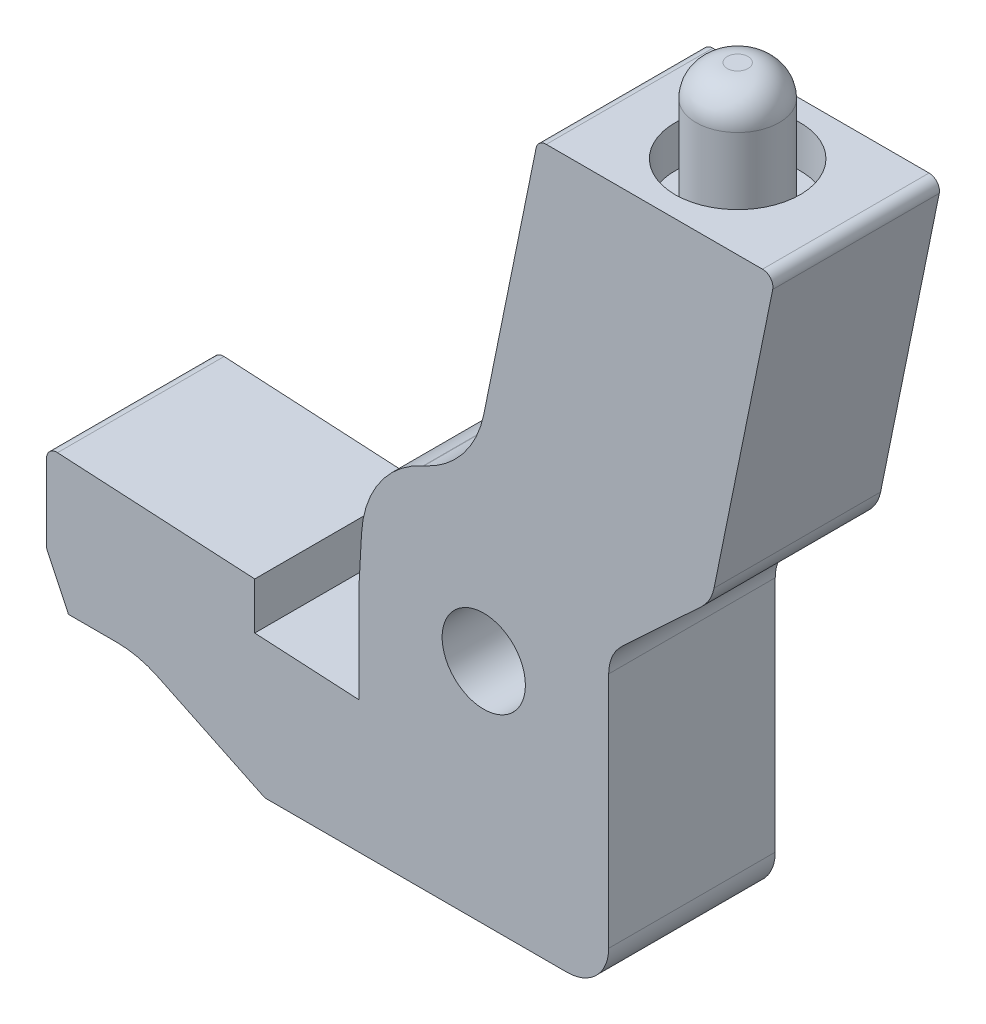
ISO-10303-21;
HEADER;
FILE_DESCRIPTION(('STEP AP214'),'2;1');
FILE_NAME('part.step','',(''),(''),'','','');
FILE_SCHEMA(('AUTOMOTIVE_DESIGN { 1 0 10303 214 1 1 1 1 }'));
ENDSEC;
DATA;
#1=APPLICATION_CONTEXT('core data for automotive mechanical design processes');
#2=APPLICATION_PROTOCOL_DEFINITION('international standard','automotive_design',2000,#1);
#3=PRODUCT_CONTEXT('',#1,'mechanical');
#4=PRODUCT('Part','Part','',(#3));
#5=PRODUCT_RELATED_PRODUCT_CATEGORY('part','',(#4));
#6=PRODUCT_DEFINITION_FORMATION('','',#4);
#7=PRODUCT_DEFINITION_CONTEXT('part definition',#1,'design');
#8=PRODUCT_DEFINITION('design','',#6,#7);
#9=PRODUCT_DEFINITION_SHAPE('','',#8);
#10=(LENGTH_UNIT() NAMED_UNIT(*) SI_UNIT(.MILLI.,.METRE.));
#11=(NAMED_UNIT(*) PLANE_ANGLE_UNIT() SI_UNIT($,.RADIAN.));
#12=(NAMED_UNIT(*) SI_UNIT($,.STERADIAN.) SOLID_ANGLE_UNIT());
#13=UNCERTAINTY_MEASURE_WITH_UNIT(LENGTH_MEASURE(1.E-05),#10,'distance_accuracy_value','');
#14=(GEOMETRIC_REPRESENTATION_CONTEXT(3) GLOBAL_UNCERTAINTY_ASSIGNED_CONTEXT((#13)) GLOBAL_UNIT_ASSIGNED_CONTEXT((#10,
#11,#12)) REPRESENTATION_CONTEXT('',''));
#15=CARTESIAN_POINT('',(0.,0.,0.));
#16=DIRECTION('',(0.,0.,1.));
#17=DIRECTION('',(1.,0.,0.));
#18=AXIS2_PLACEMENT_3D('',#15,#16,#17);
#19=CARTESIAN_POINT('',(0.,-8.02721443747306,8.));
#20=DIRECTION('',(0.,1.,0.));
#21=DIRECTION('',(0.,0.,1.));
#22=AXIS2_PLACEMENT_3D('',#19,#20,#21);
#23=PLANE('',#22);
#24=DIRECTION('',(1.,0.,0.));
#25=VECTOR('',#24,1.);
#26=CARTESIAN_POINT('',(0.,-8.02721443747306,0.));
#27=LINE('',#26,#25);
#28=CARTESIAN_POINT('',(-19.9469333029494,-8.02721443747306,0.));
#29=VERTEX_POINT('',#28);
#30=CARTESIAN_POINT('',(-17.6180688779774,-8.02721443747306,0.));
#31=VERTEX_POINT('',#30);
#32=EDGE_CURVE('E238',#29,#31,#27,.T.);
#33=ORIENTED_EDGE('',*,*,#32,.T.);
#34=DIRECTION('',(0.,0.,-1.));
#35=VECTOR('',#34,1.);
#36=CARTESIAN_POINT('',(-17.6180688779774,-8.02721443747306,8.));
#37=LINE('',#36,#35);
#38=CARTESIAN_POINT('',(-17.6180688779774,-8.02721443747306,8.));
#39=VERTEX_POINT('',#38);
#40=EDGE_CURVE('E351',#39,#31,#37,.T.);
#41=ORIENTED_EDGE('',*,*,#40,.F.);
#42=DIRECTION('',(1.,0.,0.));
#43=VECTOR('',#42,1.);
#44=CARTESIAN_POINT('',(0.,-8.02721443747306,8.));
#45=LINE('',#44,#43);
#46=CARTESIAN_POINT('',(-19.9469333029494,-8.02721443747306,8.));
#47=VERTEX_POINT('',#46);
#48=EDGE_CURVE('E399',#47,#39,#45,.T.);
#49=ORIENTED_EDGE('',*,*,#48,.F.);
#50=DIRECTION('',(0.,0.,-1.));
#51=VECTOR('',#50,1.);
#52=CARTESIAN_POINT('',(-19.9469333029494,-8.02721443747306,8.));
#53=LINE('',#52,#51);
#54=EDGE_CURVE('E231',#47,#29,#53,.T.);
#55=ORIENTED_EDGE('',*,*,#54,.T.);
#56=EDGE_LOOP('',(#33,#41,#49,#55));
#57=FACE_BOUND('',#56,.T.);
#58=ADVANCED_FACE('F35',(#57),#23,.F.);
#59=CARTESIAN_POINT('',(-17.6180688779774,-12.5467763903642,8.));
#60=DIRECTION('',(0.,0.,-1.));
#61=DIRECTION('',(-1.,0.,0.));
#62=AXIS2_PLACEMENT_3D('',#59,#60,#61);
#63=CYLINDRICAL_SURFACE('',#62,4.51956195289111);
#64=CARTESIAN_POINT('',(-17.6180688779774,-12.5467763903642,0.));
#65=DIRECTION('',(0.,0.,1.));
#66=DIRECTION('',(1.,0.,0.));
#67=AXIS2_PLACEMENT_3D('',#64,#65,#66);
#68=CIRCLE('',#67,4.51956195289111);
#69=CARTESIAN_POINT('',(-15.6640066165238,-8.47147506109,0.));
#70=VERTEX_POINT('',#69);
#71=EDGE_CURVE('E242',#31,#70,#68,.F.);
#72=ORIENTED_EDGE('',*,*,#71,.T.);
#73=DIRECTION('',(0.,0.,-1.));
#74=VECTOR('',#73,1.);
#75=CARTESIAN_POINT('',(-15.6640066165238,-8.47147506109,8.));
#76=LINE('',#75,#74);
#77=CARTESIAN_POINT('',(-15.6640066165238,-8.47147506109,8.));
#78=VERTEX_POINT('',#77);
#79=EDGE_CURVE('E348',#78,#70,#76,.T.);
#80=ORIENTED_EDGE('',*,*,#79,.F.);
#81=CARTESIAN_POINT('',(-17.6180688779774,-12.5467763903642,8.));
#82=DIRECTION('',(0.,0.,1.));
#83=DIRECTION('',(1.,0.,0.));
#84=AXIS2_PLACEMENT_3D('',#81,#82,#83);
#85=CIRCLE('',#84,4.51956195289111);
#86=EDGE_CURVE('E147',#39,#78,#85,.F.);
#87=ORIENTED_EDGE('',*,*,#86,.F.);
#88=ORIENTED_EDGE('',*,*,#40,.T.);
#89=EDGE_LOOP('',(#72,#80,#87,#88));
#90=FACE_BOUND('',#89,.T.);
#91=ADVANCED_FACE('F366',(#90),#63,.F.);
#92=CARTESIAN_POINT('',(-6.23077175359445,-12.9946076492664,8.));
#93=DIRECTION('',(0.432356560618356,0.901702725120794,0.));
#94=DIRECTION('',(-0.901702725120794,0.432356560618356,0.));
#95=AXIS2_PLACEMENT_3D('',#92,#93,#94);
#96=PLANE('',#95);
#97=DIRECTION('',(0.901702725120794,-0.432356560618356,0.));
#98=VECTOR('',#97,1.);
#99=CARTESIAN_POINT('',(-6.23077175359445,-12.9946076492664,0.));
#100=LINE('',#99,#98);
#101=CARTESIAN_POINT('',(-10.5112242538836,-10.9421776528201,0.));
#102=VERTEX_POINT('',#101);
#103=EDGE_CURVE('E244',#70,#102,#100,.T.);
#104=ORIENTED_EDGE('',*,*,#103,.T.);
#105=DIRECTION('',(0.,0.,-1.));
#106=VECTOR('',#105,1.);
#107=CARTESIAN_POINT('',(-10.5112242538836,-10.9421776528201,8.));
#108=LINE('',#107,#106);
#109=CARTESIAN_POINT('',(-10.5112242538836,-10.9421776528201,8.));
#110=VERTEX_POINT('',#109);
#111=EDGE_CURVE('E345',#110,#102,#108,.T.);
#112=ORIENTED_EDGE('',*,*,#111,.F.);
#113=DIRECTION('',(0.901702725120794,-0.432356560618356,0.));
#114=VECTOR('',#113,1.);
#115=CARTESIAN_POINT('',(-6.23077175359445,-12.9946076492664,8.));
#116=LINE('',#115,#114);
#117=EDGE_CURVE('E401',#78,#110,#116,.T.);
#118=ORIENTED_EDGE('',*,*,#117,.F.);
#119=ORIENTED_EDGE('',*,*,#79,.T.);
#120=EDGE_LOOP('',(#104,#112,#118,#119));
#121=FACE_BOUND('',#120,.T.);
#122=ADVANCED_FACE('F372',(#121),#96,.F.);
#123=CARTESIAN_POINT('',(0.,-10.9421776528201,8.));
#124=DIRECTION('',(0.,1.,0.));
#125=DIRECTION('',(-1.,0.,0.));
#126=AXIS2_PLACEMENT_3D('',#123,#124,#125);
#127=PLANE('',#126);
#128=DIRECTION('',(1.,0.,0.));
#129=VECTOR('',#128,1.);
#130=CARTESIAN_POINT('',(0.,-10.9421776528201,0.));
#131=LINE('',#130,#129);
#132=CARTESIAN_POINT('',(4.,-10.9421776528201,0.));
#133=VERTEX_POINT('',#132);
#134=EDGE_CURVE('E246',#102,#133,#131,.T.);
#135=ORIENTED_EDGE('',*,*,#134,.T.);
#136=DIRECTION('',(0.,0.,-1.));
#137=VECTOR('',#136,1.);
#138=CARTESIAN_POINT('',(4.,-10.9421776528201,8.));
#139=LINE('',#138,#137);
#140=CARTESIAN_POINT('',(4.,-10.9421776528201,8.));
#141=VERTEX_POINT('',#140);
#142=EDGE_CURVE('E342',#141,#133,#139,.T.);
#143=ORIENTED_EDGE('',*,*,#142,.F.);
#144=DIRECTION('',(1.,0.,0.));
#145=VECTOR('',#144,1.);
#146=CARTESIAN_POINT('',(0.,-10.9421776528201,8.));
#147=LINE('',#146,#145);
#148=EDGE_CURVE('E407',#110,#141,#147,.T.);
#149=ORIENTED_EDGE('',*,*,#148,.F.);
#150=ORIENTED_EDGE('',*,*,#111,.T.);
#151=EDGE_LOOP('',(#135,#143,#149,#150));
#152=FACE_BOUND('',#151,.T.);
#153=ADVANCED_FACE('F534',(#152),#127,.F.);
#154=CARTESIAN_POINT('',(4.,-8.94217765282007,8.));
#155=DIRECTION('',(0.,0.,-1.));
#156=DIRECTION('',(-1.,0.,0.));
#157=AXIS2_PLACEMENT_3D('',#154,#155,#156);
#158=CYLINDRICAL_SURFACE('',#157,2.);
#159=CARTESIAN_POINT('',(4.,-8.94217765282007,0.));
#160=DIRECTION('',(0.,0.,1.));
#161=DIRECTION('',(1.,0.,0.));
#162=AXIS2_PLACEMENT_3D('',#159,#160,#161);
#163=CIRCLE('',#162,2.);
#164=CARTESIAN_POINT('',(6.,-8.94217765282007,0.));
#165=VERTEX_POINT('',#164);
#166=EDGE_CURVE('E248',#133,#165,#163,.T.);
#167=ORIENTED_EDGE('',*,*,#166,.T.);
#168=DIRECTION('',(0.,0.,-1.));
#169=VECTOR('',#168,1.);
#170=CARTESIAN_POINT('',(6.,-8.94217765282007,8.));
#171=LINE('',#170,#169);
#172=CARTESIAN_POINT('',(6.,-8.94217765282007,8.));
#173=VERTEX_POINT('',#172);
#174=EDGE_CURVE('E339',#173,#165,#171,.T.);
#175=ORIENTED_EDGE('',*,*,#174,.F.);
#176=CARTESIAN_POINT('',(4.,-8.94217765282007,8.));
#177=DIRECTION('',(0.,0.,1.));
#178=DIRECTION('',(1.,0.,0.));
#179=AXIS2_PLACEMENT_3D('',#176,#177,#178);
#180=CIRCLE('',#179,2.);
#181=EDGE_CURVE('E409',#141,#173,#180,.T.);
#182=ORIENTED_EDGE('',*,*,#181,.F.);
#183=ORIENTED_EDGE('',*,*,#142,.T.);
#184=EDGE_LOOP('',(#167,#175,#182,#183));
#185=FACE_BOUND('',#184,.T.);
#186=ADVANCED_FACE('F530',(#185),#158,.T.);
#187=CARTESIAN_POINT('',(6.,0.,8.));
#188=DIRECTION('',(-1.,0.,0.));
#189=DIRECTION('',(0.,0.,1.));
#190=AXIS2_PLACEMENT_3D('',#187,#188,#189);
#191=PLANE('',#190);
#192=DIRECTION('',(0.,1.,0.));
#193=VECTOR('',#192,1.);
#194=CARTESIAN_POINT('',(6.,0.,0.));
#195=LINE('',#194,#193);
#196=CARTESIAN_POINT('',(6.,2.4715085240647,0.));
#197=VERTEX_POINT('',#196);
#198=EDGE_CURVE('E250',#165,#197,#195,.T.);
#199=ORIENTED_EDGE('',*,*,#198,.T.);
#200=DIRECTION('',(0.,0.,-1.));
#201=VECTOR('',#200,1.);
#202=CARTESIAN_POINT('',(6.,2.4715085240647,8.));
#203=LINE('',#202,#201);
#204=CARTESIAN_POINT('',(6.,2.4715085240647,8.));
#205=VERTEX_POINT('',#204);
#206=EDGE_CURVE('E336',#205,#197,#203,.T.);
#207=ORIENTED_EDGE('',*,*,#206,.F.);
#208=DIRECTION('',(0.,1.,0.));
#209=VECTOR('',#208,1.);
#210=CARTESIAN_POINT('',(6.,0.,8.));
#211=LINE('',#210,#209);
#212=EDGE_CURVE('E411',#173,#205,#211,.T.);
#213=ORIENTED_EDGE('',*,*,#212,.F.);
#214=ORIENTED_EDGE('',*,*,#174,.T.);
#215=EDGE_LOOP('',(#199,#207,#213,#214));
#216=FACE_BOUND('',#215,.T.);
#217=ADVANCED_FACE('F525',(#216),#191,.F.);
#218=CARTESIAN_POINT('',(8.,2.4715085240647,8.));
#219=DIRECTION('',(0.,0.,-1.));
#220=DIRECTION('',(-1.,0.,0.));
#221=AXIS2_PLACEMENT_3D('',#218,#219,#220);
#222=CYLINDRICAL_SURFACE('',#221,2.);
#223=CARTESIAN_POINT('',(8.,2.4715085240647,0.));
#224=DIRECTION('',(0.,0.,1.));
#225=DIRECTION('',(1.,0.,0.));
#226=AXIS2_PLACEMENT_3D('',#223,#224,#225);
#227=CIRCLE('',#226,2.);
#228=CARTESIAN_POINT('',(6.636003279875,3.93421592730303,0.));
#229=VERTEX_POINT('',#228);
#230=EDGE_CURVE('E252',#197,#229,#227,.F.);
#231=ORIENTED_EDGE('',*,*,#230,.T.);
#232=DIRECTION('',(0.,0.,-1.));
#233=VECTOR('',#232,1.);
#234=CARTESIAN_POINT('',(6.636003279875,3.93421592730303,8.));
#235=LINE('',#234,#233);
#236=CARTESIAN_POINT('',(6.636003279875,3.93421592730303,8.));
#237=VERTEX_POINT('',#236);
#238=EDGE_CURVE('E334',#237,#229,#235,.T.);
#239=ORIENTED_EDGE('',*,*,#238,.F.);
#240=CARTESIAN_POINT('',(8.,2.4715085240647,8.));
#241=DIRECTION('',(0.,0.,1.));
#242=DIRECTION('',(1.,0.,0.));
#243=AXIS2_PLACEMENT_3D('',#240,#241,#242);
#244=CIRCLE('',#243,2.);
#245=EDGE_CURVE('E413',#205,#237,#244,.F.);
#246=ORIENTED_EDGE('',*,*,#245,.F.);
#247=ORIENTED_EDGE('',*,*,#206,.T.);
#248=EDGE_LOOP('',(#231,#239,#246,#247));
#249=FACE_BOUND('',#248,.T.);
#250=ADVANCED_FACE('F519',(#249),#222,.F.);
#251=CARTESIAN_POINT('',(1.12423335813971,-1.20559267603498,8.));
#252=DIRECTION('',(0.681998360062503,-0.731353701619167,0.));
#253=DIRECTION('',(0.731353701619167,0.681998360062503,0.));
#254=AXIS2_PLACEMENT_3D('',#251,#252,#253);
#255=PLANE('',#254);
#256=DIRECTION('',(-0.731353701619167,-0.681998360062503,0.));
#257=VECTOR('',#256,1.);
#258=CARTESIAN_POINT('',(1.12423335813971,-1.20559267603498,0.));
#259=LINE('',#258,#257);
#260=CARTESIAN_POINT('',(10.4654039590362,7.50518983148667,0.));
#261=VERTEX_POINT('',#260);
#262=EDGE_CURVE('E255',#261,#229,#259,.T.);
#263=ORIENTED_EDGE('',*,*,#262,.F.);
#264=DIRECTION('',(0.,0.,-1.));
#265=VECTOR('',#264,1.);
#266=CARTESIAN_POINT('',(10.4654039590362,7.50518983148667,8.));
#267=LINE('',#266,#265);
#268=CARTESIAN_POINT('',(10.4654039590362,7.50518983148667,8.));
#269=VERTEX_POINT('',#268);
#270=EDGE_CURVE('E332',#269,#261,#267,.T.);
#271=ORIENTED_EDGE('',*,*,#270,.F.);
#272=DIRECTION('',(-0.731353701619167,-0.681998360062503,0.));
#273=VECTOR('',#272,1.);
#274=CARTESIAN_POINT('',(1.12423335813971,-1.20559267603498,8.));
#275=LINE('',#274,#273);
#276=EDGE_CURVE('E415',#269,#237,#275,.T.);
#277=ORIENTED_EDGE('',*,*,#276,.T.);
#278=ORIENTED_EDGE('',*,*,#238,.T.);
#279=EDGE_LOOP('',(#263,#271,#277,#278));
#280=FACE_BOUND('',#279,.T.);
#281=ADVANCED_FACE('F515',(#280),#255,.T.);
#282=CARTESIAN_POINT('',(9.10140723891116,8.96789723472501,8.));
#283=DIRECTION('',(0.,0.,-1.));
#284=DIRECTION('',(-1.,0.,0.));
#285=AXIS2_PLACEMENT_3D('',#282,#283,#284);
#286=CYLINDRICAL_SURFACE('',#285,2.);
#287=CARTESIAN_POINT('',(9.10140723891116,8.96789723472501,0.));
#288=DIRECTION('',(0.,0.,1.));
#289=DIRECTION('',(1.,0.,0.));
#290=AXIS2_PLACEMENT_3D('',#287,#288,#289);
#291=CIRCLE('',#290,2.);
#292=CARTESIAN_POINT('',(11.0611834938011,8.56880196944402,0.));
#293=VERTEX_POINT('',#292);
#294=EDGE_CURVE('E258',#293,#261,#291,.F.);
#295=ORIENTED_EDGE('',*,*,#294,.F.);
#296=DIRECTION('',(0.,0.,-1.));
#297=VECTOR('',#296,1.);
#298=CARTESIAN_POINT('',(11.0611834938011,8.56880196944402,8.));
#299=LINE('',#298,#297);
#300=CARTESIAN_POINT('',(11.0611834938011,8.56880196944402,8.));
#301=VERTEX_POINT('',#300);
#302=EDGE_CURVE('E330',#301,#293,#299,.T.);
#303=ORIENTED_EDGE('',*,*,#302,.F.);
#304=CARTESIAN_POINT('',(9.10140723891116,8.96789723472501,8.));
#305=DIRECTION('',(0.,0.,1.));
#306=DIRECTION('',(1.,0.,0.));
#307=AXIS2_PLACEMENT_3D('',#304,#305,#306);
#308=CIRCLE('',#307,2.);
#309=EDGE_CURVE('E418',#301,#269,#308,.F.);
#310=ORIENTED_EDGE('',*,*,#309,.T.);
#311=ORIENTED_EDGE('',*,*,#270,.T.);
#312=EDGE_LOOP('',(#295,#303,#310,#311));
#313=FACE_BOUND('',#312,.T.);
#314=ADVANCED_FACE('F511',(#313),#286,.T.);
#315=CARTESIAN_POINT('',(8.94524020237024,-1.82163805825254,8.));
#316=DIRECTION('',(0.979888127444952,-0.199547632640493,0.));
#317=DIRECTION('',(0.199547632640493,0.979888127444952,0.));
#318=AXIS2_PLACEMENT_3D('',#315,#316,#317);
#319=PLANE('',#318);
#320=DIRECTION('',(-0.199547632640493,-0.979888127444952,0.));
#321=VECTOR('',#320,1.);
#322=CARTESIAN_POINT('',(8.94524020237024,-1.82163805825254,0.));
#323=LINE('',#322,#321);
#324=CARTESIAN_POINT('',(13.8778600925817,22.4002261836798,0.));
#325=VERTEX_POINT('',#324);
#326=EDGE_CURVE('E261',#325,#293,#323,.T.);
#327=ORIENTED_EDGE('',*,*,#326,.F.);
#328=DIRECTION('',(0.,0.,-1.));
#329=VECTOR('',#328,1.);
#330=CARTESIAN_POINT('',(13.8778600925817,22.4002261836798,8.));
#331=LINE('',#330,#329);
#332=CARTESIAN_POINT('',(13.8778600925817,22.4002261836798,8.));
#333=VERTEX_POINT('',#332);
#334=EDGE_CURVE('E328',#333,#325,#331,.T.);
#335=ORIENTED_EDGE('',*,*,#334,.F.);
#336=DIRECTION('',(-0.199547632640493,-0.979888127444952,0.));
#337=VECTOR('',#336,1.);
#338=CARTESIAN_POINT('',(8.94524020237024,-1.82163805825254,8.));
#339=LINE('',#338,#337);
#340=EDGE_CURVE('E421',#333,#301,#339,.T.);
#341=ORIENTED_EDGE('',*,*,#340,.T.);
#342=ORIENTED_EDGE('',*,*,#302,.T.);
#343=EDGE_LOOP('',(#327,#335,#341,#342));
#344=FACE_BOUND('',#343,.T.);
#345=ADVANCED_FACE('F506',(#344),#319,.T.);
#346=CARTESIAN_POINT('',(13.3879160288592,22.5,8.));
#347=DIRECTION('',(0.,0.,-1.));
#348=DIRECTION('',(-1.,0.,0.));
#349=AXIS2_PLACEMENT_3D('',#346,#347,#348);
#350=CYLINDRICAL_SURFACE('',#349,0.5);
#351=CARTESIAN_POINT('',(13.3879160288592,22.5,0.));
#352=DIRECTION('',(0.,0.,1.));
#353=DIRECTION('',(1.,0.,0.));
#354=AXIS2_PLACEMENT_3D('',#351,#352,#353);
#355=CIRCLE('',#354,0.5);
#356=CARTESIAN_POINT('',(13.3879160288592,23.,0.));
#357=VERTEX_POINT('',#356);
#358=EDGE_CURVE('E264',#357,#325,#355,.F.);
#359=ORIENTED_EDGE('',*,*,#358,.F.);
#360=DIRECTION('',(0.,0.,-1.));
#361=VECTOR('',#360,1.);
#362=CARTESIAN_POINT('',(13.3879160288592,23.,8.));
#363=LINE('',#362,#361);
#364=CARTESIAN_POINT('',(13.3879160288592,23.,8.));
#365=VERTEX_POINT('',#364);
#366=EDGE_CURVE('E326',#365,#357,#363,.T.);
#367=ORIENTED_EDGE('',*,*,#366,.F.);
#368=CARTESIAN_POINT('',(13.3879160288592,22.5,8.));
#369=DIRECTION('',(0.,0.,1.));
#370=DIRECTION('',(1.,0.,0.));
#371=AXIS2_PLACEMENT_3D('',#368,#369,#370);
#372=CIRCLE('',#371,0.5);
#373=EDGE_CURVE('E424',#365,#333,#372,.F.);
#374=ORIENTED_EDGE('',*,*,#373,.T.);
#375=ORIENTED_EDGE('',*,*,#334,.T.);
#376=EDGE_LOOP('',(#359,#367,#374,#375));
#377=FACE_BOUND('',#376,.T.);
#378=ADVANCED_FACE('F502',(#377),#350,.T.);
#379=CARTESIAN_POINT('',(0.,23.,8.));
#380=DIRECTION('',(0.,1.,0.));
#381=DIRECTION('',(0.,0.,1.));
#382=AXIS2_PLACEMENT_3D('',#379,#380,#381);
#383=PLANE('',#382);
#384=CARTESIAN_POINT('',(8.19523981651981,23.,4.));
#385=DIRECTION('',(0.,1.,0.));
#386=DIRECTION('',(0.,0.,1.));
#387=AXIS2_PLACEMENT_3D('',#384,#385,#386);
#388=CIRCLE('',#387,3.);
#389=CARTESIAN_POINT('',(8.19523981651981,23.,7.));
#390=VERTEX_POINT('',#389);
#391=EDGE_CURVE('E604',#390,#390,#388,.T.);
#392=ORIENTED_EDGE('',*,*,#391,.F.);
#393=EDGE_LOOP('',(#392));
#394=FACE_BOUND('',#393,.T.);
#395=DIRECTION('',(1.,0.,0.));
#396=VECTOR('',#395,1.);
#397=CARTESIAN_POINT('',(0.,23.,0.));
#398=LINE('',#397,#396);
#399=CARTESIAN_POINT('',(3.00256360418044,23.,0.));
#400=VERTEX_POINT('',#399);
#401=EDGE_CURVE('E267',#400,#357,#398,.T.);
#402=ORIENTED_EDGE('',*,*,#401,.F.);
#403=DIRECTION('',(0.,0.,-1.));
#404=VECTOR('',#403,1.);
#405=CARTESIAN_POINT('',(3.00256360418044,23.,8.));
#406=LINE('',#405,#404);
#407=CARTESIAN_POINT('',(3.00256360418044,23.,8.));
#408=VERTEX_POINT('',#407);
#409=EDGE_CURVE('E324',#408,#400,#406,.T.);
#410=ORIENTED_EDGE('',*,*,#409,.F.);
#411=DIRECTION('',(1.,0.,0.));
#412=VECTOR('',#411,1.);
#413=CARTESIAN_POINT('',(0.,23.,8.));
#414=LINE('',#413,#412);
#415=EDGE_CURVE('E427',#408,#365,#414,.T.);
#416=ORIENTED_EDGE('',*,*,#415,.T.);
#417=ORIENTED_EDGE('',*,*,#366,.T.);
#418=EDGE_LOOP('',(#402,#410,#416,#417));
#419=FACE_BOUND('',#418,.T.);
#420=ADVANCED_FACE('F498',(#394,#419),#383,.T.);
#421=CARTESIAN_POINT('',(3.00256360418044,22.5,8.));
#422=DIRECTION('',(0.,0.,-1.));
#423=DIRECTION('',(-1.,0.,0.));
#424=AXIS2_PLACEMENT_3D('',#421,#422,#423);
#425=CYLINDRICAL_SURFACE('',#424,0.500000000000002);
#426=CARTESIAN_POINT('',(3.00256360418044,22.5,0.));
#427=DIRECTION('',(0.,0.,1.));
#428=DIRECTION('',(1.,0.,0.));
#429=AXIS2_PLACEMENT_3D('',#426,#427,#428);
#430=CIRCLE('',#429,0.500000000000002);
#431=CARTESIAN_POINT('',(2.51261954045796,22.5997738163202,0.));
#432=VERTEX_POINT('',#431);
#433=EDGE_CURVE('E270',#432,#400,#430,.F.);
#434=ORIENTED_EDGE('',*,*,#433,.F.);
#435=DIRECTION('',(0.,0.,-1.));
#436=VECTOR('',#435,1.);
#437=CARTESIAN_POINT('',(2.51261954045796,22.5997738163202,8.));
#438=LINE('',#437,#436);
#439=CARTESIAN_POINT('',(2.51261954045796,22.5997738163202,8.));
#440=VERTEX_POINT('',#439);
#441=EDGE_CURVE('E322',#440,#432,#438,.T.);
#442=ORIENTED_EDGE('',*,*,#441,.F.);
#443=CARTESIAN_POINT('',(3.00256360418044,22.5,8.));
#444=DIRECTION('',(0.,0.,1.));
#445=DIRECTION('',(1.,0.,0.));
#446=AXIS2_PLACEMENT_3D('',#443,#444,#445);
#447=CIRCLE('',#446,0.500000000000002);
#448=EDGE_CURVE('E430',#440,#408,#447,.F.);
#449=ORIENTED_EDGE('',*,*,#448,.T.);
#450=ORIENTED_EDGE('',*,*,#409,.T.);
#451=EDGE_LOOP('',(#434,#442,#449,#450));
#452=FACE_BOUND('',#451,.T.);
#453=ADVANCED_FACE('F494',(#452),#425,.T.);
#454=CARTESIAN_POINT('',(-2.00646332532852,0.408602773454635,8.));
#455=DIRECTION('',(-0.979888127444952,0.199547632640493,0.));
#456=DIRECTION('',(-0.199547632640493,-0.979888127444952,0.));
#457=AXIS2_PLACEMENT_3D('',#454,#455,#456);
#458=PLANE('',#457);
#459=DIRECTION('',(0.199547632640493,0.979888127444952,0.));
#460=VECTOR('',#459,1.);
#461=CARTESIAN_POINT('',(-2.00646332532852,0.408602773454635,0.));
#462=LINE('',#461,#460);
#463=CARTESIAN_POINT('',(0.,10.2614362279376,0.));
#464=VERTEX_POINT('',#463);
#465=EDGE_CURVE('E273',#464,#432,#462,.T.);
#466=ORIENTED_EDGE('',*,*,#465,.F.);
#467=DIRECTION('',(0.,0.,-1.));
#468=VECTOR('',#467,1.);
#469=CARTESIAN_POINT('',(0.,10.2614362279376,8.));
#470=LINE('',#469,#468);
#471=CARTESIAN_POINT('',(0.,10.2614362279376,8.));
#472=VERTEX_POINT('',#471);
#473=EDGE_CURVE('E320',#472,#464,#470,.T.);
#474=ORIENTED_EDGE('',*,*,#473,.F.);
#475=DIRECTION('',(0.199547632640493,0.979888127444952,0.));
#476=VECTOR('',#475,1.);
#477=CARTESIAN_POINT('',(-2.00646332532852,0.408602773454635,8.));
#478=LINE('',#477,#476);
#479=EDGE_CURVE('E433',#472,#440,#478,.T.);
#480=ORIENTED_EDGE('',*,*,#479,.T.);
#481=ORIENTED_EDGE('',*,*,#441,.T.);
#482=EDGE_LOOP('',(#466,#474,#480,#481));
#483=FACE_BOUND('',#482,.T.);
#484=ADVANCED_FACE('F490',(#483),#458,.T.);
#485=CARTESIAN_POINT('',(-4.89944063722476,11.2591743911401,8.));
#486=DIRECTION('',(0.,0.,-1.));
#487=DIRECTION('',(-1.,0.,0.));
#488=AXIS2_PLACEMENT_3D('',#485,#486,#487);
#489=CYLINDRICAL_SURFACE('',#488,4.99999999999999);
#490=CARTESIAN_POINT('',(-4.89944063722476,11.2591743911401,0.));
#491=DIRECTION('',(0.,0.,1.));
#492=DIRECTION('',(1.,0.,0.));
#493=AXIS2_PLACEMENT_3D('',#490,#491,#492);
#494=CIRCLE('',#493,4.99999999999999);
#495=CARTESIAN_POINT('',(-2.8684319875703,6.69025724754592,0.));
#496=VERTEX_POINT('',#495);
#497=EDGE_CURVE('E276',#496,#464,#494,.T.);
#498=ORIENTED_EDGE('',*,*,#497,.F.);
#499=DIRECTION('',(0.,0.,-1.));
#500=VECTOR('',#499,1.);
#501=CARTESIAN_POINT('',(-2.8684319875703,6.69025724754592,8.));
#502=LINE('',#501,#500);
#503=CARTESIAN_POINT('',(-2.8684319875703,6.69025724754592,8.));
#504=VERTEX_POINT('',#503);
#505=EDGE_CURVE('E318',#504,#496,#502,.T.);
#506=ORIENTED_EDGE('',*,*,#505,.F.);
#507=CARTESIAN_POINT('',(-4.89944063722476,11.2591743911401,8.));
#508=DIRECTION('',(0.,0.,1.));
#509=DIRECTION('',(1.,0.,0.));
#510=AXIS2_PLACEMENT_3D('',#507,#508,#509);
#511=CIRCLE('',#510,4.99999999999999);
#512=EDGE_CURVE('E436',#504,#472,#511,.T.);
#513=ORIENTED_EDGE('',*,*,#512,.T.);
#514=ORIENTED_EDGE('',*,*,#473,.T.);
#515=EDGE_LOOP('',(#498,#506,#513,#514));
#516=FACE_BOUND('',#515,.T.);
#517=ADVANCED_FACE('F486',(#516),#489,.F.);
#518=CARTESIAN_POINT('',(-2.95658325947271,6.65107159587295,8.));
#519=DIRECTION('',(-0.406201729930374,0.913783428719066,0.));
#520=DIRECTION('',(-0.913783428719066,-0.406201729930374,0.));
#521=AXIS2_PLACEMENT_3D('',#518,#519,#520);
#522=PLANE('',#521);
#523=DIRECTION('',(0.913783428719066,0.406201729930374,0.));
#524=VECTOR('',#523,1.);
#525=CARTESIAN_POINT('',(-2.95658325947271,6.65107159587295,0.));
#526=LINE('',#525,#524);
#527=CARTESIAN_POINT('',(-2.90918753066757,6.67214029380168,0.));
#528=VERTEX_POINT('',#527);
#529=EDGE_CURVE('E279',#528,#496,#526,.T.);
#530=ORIENTED_EDGE('',*,*,#529,.F.);
#531=DIRECTION('',(0.,0.,-1.));
#532=VECTOR('',#531,1.);
#533=CARTESIAN_POINT('',(-2.90918753066757,6.67214029380168,8.));
#534=LINE('',#533,#532);
#535=CARTESIAN_POINT('',(-2.90918753066757,6.67214029380168,8.));
#536=VERTEX_POINT('',#535);
#537=EDGE_CURVE('E316',#536,#528,#534,.T.);
#538=ORIENTED_EDGE('',*,*,#537,.F.);
#539=DIRECTION('',(0.913783428719066,0.406201729930374,0.));
#540=VECTOR('',#539,1.);
#541=CARTESIAN_POINT('',(-2.95658325947271,6.65107159587295,8.));
#542=LINE('',#541,#540);
#543=EDGE_CURVE('E439',#536,#504,#542,.T.);
#544=ORIENTED_EDGE('',*,*,#543,.T.);
#545=ORIENTED_EDGE('',*,*,#505,.T.);
#546=EDGE_LOOP('',(#530,#538,#544,#545));
#547=FACE_BOUND('',#546,.T.);
#548=ADVANCED_FACE('F482',(#547),#522,.T.);
#549=CARTESIAN_POINT('',(-0.878178881013461,2.10322315020731,8.));
#550=DIRECTION('',(0.,0.,-1.));
#551=DIRECTION('',(-1.,0.,0.));
#552=AXIS2_PLACEMENT_3D('',#549,#550,#551);
#553=CYLINDRICAL_SURFACE('',#552,5.00000000000002);
#554=CARTESIAN_POINT('',(-0.878178881013461,2.10322315020731,0.));
#555=DIRECTION('',(0.,0.,1.));
#556=DIRECTION('',(1.,0.,0.));
#557=AXIS2_PLACEMENT_3D('',#554,#555,#556);
#558=CIRCLE('',#557,5.00000000000002);
#559=CARTESIAN_POINT('',(-5.87079539674181,2.37484849305411,0.));
#560=VERTEX_POINT('',#559);
#561=EDGE_CURVE('E282',#560,#528,#558,.F.);
#562=ORIENTED_EDGE('',*,*,#561,.F.);
#563=DIRECTION('',(0.,0.,-1.));
#564=VECTOR('',#563,1.);
#565=CARTESIAN_POINT('',(-5.87079539674181,2.37484849305411,8.));
#566=LINE('',#565,#564);
#567=CARTESIAN_POINT('',(-5.87079539674181,2.37484849305411,8.));
#568=VERTEX_POINT('',#567);
#569=EDGE_CURVE('E314',#568,#560,#566,.T.);
#570=ORIENTED_EDGE('',*,*,#569,.F.);
#571=CARTESIAN_POINT('',(-0.878178881013461,2.10322315020731,8.));
#572=DIRECTION('',(0.,0.,1.));
#573=DIRECTION('',(1.,0.,0.));
#574=AXIS2_PLACEMENT_3D('',#571,#572,#573);
#575=CIRCLE('',#574,5.00000000000002);
#576=EDGE_CURVE('E442',#568,#536,#575,.F.);
#577=ORIENTED_EDGE('',*,*,#576,.T.);
#578=ORIENTED_EDGE('',*,*,#537,.T.);
#579=EDGE_LOOP('',(#562,#570,#577,#578));
#580=FACE_BOUND('',#579,.T.);
#581=ADVANCED_FACE('F478',(#580),#553,.T.);
#582=CARTESIAN_POINT('',(-5.98229272154961,0.325469081468915,8.));
#583=DIRECTION('',(0.998523303145668,-0.0543250685693536,0.));
#584=DIRECTION('',(0.0543250685693536,0.998523303145668,0.));
#585=AXIS2_PLACEMENT_3D('',#582,#583,#584);
#586=PLANE('',#585);
#587=DIRECTION('',(-0.0543250685693536,-0.998523303145668,0.));
#588=VECTOR('',#587,1.);
#589=CARTESIAN_POINT('',(-5.98229272154961,0.325469081468915,0.));
#590=LINE('',#589,#588);
#591=CARTESIAN_POINT('',(-6.,0.,0.));
#592=VERTEX_POINT('',#591);
#593=EDGE_CURVE('E285',#560,#592,#590,.T.);
#594=ORIENTED_EDGE('',*,*,#593,.T.);
#595=DIRECTION('',(0.,0.,-1.));
#596=VECTOR('',#595,1.);
#597=CARTESIAN_POINT('',(-6.,0.,8.));
#598=LINE('',#597,#596);
#599=CARTESIAN_POINT('',(-6.,0.,8.));
#600=VERTEX_POINT('',#599);
#601=EDGE_CURVE('E311',#600,#592,#598,.T.);
#602=ORIENTED_EDGE('',*,*,#601,.F.);
#603=DIRECTION('',(-0.0543250685693536,-0.998523303145668,0.));
#604=VECTOR('',#603,1.);
#605=CARTESIAN_POINT('',(-5.98229272154961,0.325469081468915,8.));
#606=LINE('',#605,#604);
#607=EDGE_CURVE('E445',#568,#600,#606,.T.);
#608=ORIENTED_EDGE('',*,*,#607,.F.);
#609=ORIENTED_EDGE('',*,*,#569,.T.);
#610=EDGE_LOOP('',(#594,#602,#608,#609));
#611=FACE_BOUND('',#610,.T.);
#612=ADVANCED_FACE('F474',(#611),#586,.F.);
#613=CARTESIAN_POINT('',(-6.,0.,8.));
#614=DIRECTION('',(1.,0.,0.));
#615=DIRECTION('',(0.,1.,0.));
#616=AXIS2_PLACEMENT_3D('',#613,#614,#615);
#617=PLANE('',#616);
#618=DIRECTION('',(0.,-1.,0.));
#619=VECTOR('',#618,1.);
#620=CARTESIAN_POINT('',(-6.,0.,0.));
#621=LINE('',#620,#619);
#622=CARTESIAN_POINT('',(-6.,-4.6013567560376,0.));
#623=VERTEX_POINT('',#622);
#624=EDGE_CURVE('E287',#592,#623,#621,.T.);
#625=ORIENTED_EDGE('',*,*,#624,.T.);
#626=DIRECTION('',(0.,0.,-1.));
#627=VECTOR('',#626,1.);
#628=CARTESIAN_POINT('',(-6.,-4.6013567560376,8.));
#629=LINE('',#628,#627);
#630=CARTESIAN_POINT('',(-6.,-4.6013567560376,8.));
#631=VERTEX_POINT('',#630);
#632=EDGE_CURVE('E308',#631,#623,#629,.T.);
#633=ORIENTED_EDGE('',*,*,#632,.F.);
#634=DIRECTION('',(0.,-1.,0.));
#635=VECTOR('',#634,1.);
#636=CARTESIAN_POINT('',(-6.,0.,8.));
#637=LINE('',#636,#635);
#638=EDGE_CURVE('E447',#600,#631,#637,.T.);
#639=ORIENTED_EDGE('',*,*,#638,.F.);
#640=ORIENTED_EDGE('',*,*,#601,.T.);
#641=EDGE_LOOP('',(#625,#633,#639,#640));
#642=FACE_BOUND('',#641,.T.);
#643=ADVANCED_FACE('F470',(#642),#617,.F.);
#644=CARTESIAN_POINT('',(-0.267307171266782,-4.91324625328506,8.));
#645=DIRECTION('',(-0.0543250685693539,-0.998523303145668,0.));
#646=DIRECTION('',(0.998523303145668,-0.0543250685693539,0.));
#647=AXIS2_PLACEMENT_3D('',#644,#645,#646);
#648=PLANE('',#647);
#649=DIRECTION('',(-0.998523303145668,0.0543250685693539,0.));
#650=VECTOR('',#649,1.);
#651=CARTESIAN_POINT('',(-0.267307171266782,-4.91324625328506,0.));
#652=LINE('',#651,#650);
#653=CARTESIAN_POINT('',(-11.,-4.32932971171018,0.));
#654=VERTEX_POINT('',#653);
#655=EDGE_CURVE('E289',#623,#654,#652,.T.);
#656=ORIENTED_EDGE('',*,*,#655,.T.);
#657=DIRECTION('',(0.,0.,-1.));
#658=VECTOR('',#657,1.);
#659=CARTESIAN_POINT('',(-11.,-4.32932971171018,8.));
#660=LINE('',#659,#658);
#661=CARTESIAN_POINT('',(-11.,-4.32932971171018,8.));
#662=VERTEX_POINT('',#661);
#663=EDGE_CURVE('E305',#662,#654,#660,.T.);
#664=ORIENTED_EDGE('',*,*,#663,.F.);
#665=DIRECTION('',(-0.998523303145668,0.0543250685693539,0.));
#666=VECTOR('',#665,1.);
#667=CARTESIAN_POINT('',(-0.267307171266782,-4.91324625328506,8.));
#668=LINE('',#667,#666);
#669=EDGE_CURVE('E449',#631,#662,#668,.T.);
#670=ORIENTED_EDGE('',*,*,#669,.F.);
#671=ORIENTED_EDGE('',*,*,#632,.T.);
#672=EDGE_LOOP('',(#656,#664,#670,#671));
#673=FACE_BOUND('',#672,.T.);
#674=ADVANCED_FACE('F466',(#673),#648,.F.);
#675=CARTESIAN_POINT('',(-11.,0.,8.));
#676=DIRECTION('',(-1.,0.,0.));
#677=DIRECTION('',(0.,0.,1.));
#678=AXIS2_PLACEMENT_3D('',#675,#676,#677);
#679=PLANE('',#678);
#680=DIRECTION('',(0.,1.,0.));
#681=VECTOR('',#680,1.);
#682=CARTESIAN_POINT('',(-11.,0.,0.));
#683=LINE('',#682,#681);
#684=CARTESIAN_POINT('',(-11.,-2.07845002833933,0.));
#685=VERTEX_POINT('',#684);
#686=EDGE_CURVE('E291',#654,#685,#683,.T.);
#687=ORIENTED_EDGE('',*,*,#686,.T.);
#688=DIRECTION('',(0.,0.,-1.));
#689=VECTOR('',#688,1.);
#690=CARTESIAN_POINT('',(-11.,-2.07845002833933,8.));
#691=LINE('',#690,#689);
#692=CARTESIAN_POINT('',(-11.,-2.07845002833933,8.));
#693=VERTEX_POINT('',#692);
#694=EDGE_CURVE('E302',#693,#685,#691,.T.);
#695=ORIENTED_EDGE('',*,*,#694,.F.);
#696=DIRECTION('',(0.,1.,0.));
#697=VECTOR('',#696,1.);
#698=CARTESIAN_POINT('',(-11.,0.,8.));
#699=LINE('',#698,#697);
#700=EDGE_CURVE('E451',#662,#693,#699,.T.);
#701=ORIENTED_EDGE('',*,*,#700,.F.);
#702=ORIENTED_EDGE('',*,*,#663,.T.);
#703=EDGE_LOOP('',(#687,#695,#701,#702));
#704=FACE_BOUND('',#703,.T.);
#705=ADVANCED_FACE('F457',(#704),#679,.F.);
#706=CARTESIAN_POINT('',(-0.145208547426156,-2.66900939546617,8.));
#707=DIRECTION('',(-0.054325068569354,-0.998523303145668,0.));
#708=DIRECTION('',(0.998523303145668,-0.054325068569354,0.));
#709=AXIS2_PLACEMENT_3D('',#706,#707,#708);
#710=PLANE('',#709);
#711=DIRECTION('',(-0.998523303145668,0.054325068569354,0.));
#712=VECTOR('',#711,1.);
#713=CARTESIAN_POINT('',(-0.145208547426156,-2.66900939546617,0.));
#714=LINE('',#713,#712);
#715=CARTESIAN_POINT('',(-20.4728374657153,-1.56307643290081,0.));
#716=VERTEX_POINT('',#715);
#717=EDGE_CURVE('E293',#685,#716,#714,.T.);
#718=ORIENTED_EDGE('',*,*,#717,.T.);
#719=DIRECTION('',(0.,0.,-1.));
#720=VECTOR('',#719,1.);
#721=CARTESIAN_POINT('',(-20.4728374657153,-1.56307643290081,8.));
#722=LINE('',#721,#720);
#723=CARTESIAN_POINT('',(-20.4728374657153,-1.56307643290081,8.));
#724=VERTEX_POINT('',#723);
#725=EDGE_CURVE('E226',#724,#716,#722,.T.);
#726=ORIENTED_EDGE('',*,*,#725,.F.);
#727=DIRECTION('',(-0.998523303145668,0.054325068569354,0.));
#728=VECTOR('',#727,1.);
#729=CARTESIAN_POINT('',(-0.145208547426156,-2.66900939546617,8.));
#730=LINE('',#729,#728);
#731=EDGE_CURVE('E217',#693,#724,#730,.T.);
#732=ORIENTED_EDGE('',*,*,#731,.F.);
#733=ORIENTED_EDGE('',*,*,#694,.T.);
#734=EDGE_LOOP('',(#718,#726,#732,#733));
#735=FACE_BOUND('',#734,.T.);
#736=ADVANCED_FACE('F461',(#735),#710,.F.);
#737=CARTESIAN_POINT('',(-20.5,-2.06233808447364,8.));
#738=DIRECTION('',(0.,0.,-1.));
#739=DIRECTION('',(-1.,0.,0.));
#740=AXIS2_PLACEMENT_3D('',#737,#738,#739);
#741=CYLINDRICAL_SURFACE('',#740,0.5);
#742=CARTESIAN_POINT('',(-20.5,-2.06233808447364,0.));
#743=DIRECTION('',(0.,0.,1.));
#744=DIRECTION('',(1.,0.,0.));
#745=AXIS2_PLACEMENT_3D('',#742,#743,#744);
#746=CIRCLE('',#745,0.5);
#747=CARTESIAN_POINT('',(-21.,-2.06233808447365,0.));
#748=VERTEX_POINT('',#747);
#749=EDGE_CURVE('E225',#716,#748,#746,.T.);
#750=ORIENTED_EDGE('',*,*,#749,.T.);
#751=DIRECTION('',(0.,0.,-1.));
#752=VECTOR('',#751,1.);
#753=CARTESIAN_POINT('',(-21.,-2.06233808447365,8.));
#754=LINE('',#753,#752);
#755=CARTESIAN_POINT('',(-21.,-2.06233808447365,8.));
#756=VERTEX_POINT('',#755);
#757=EDGE_CURVE('E222',#756,#748,#754,.T.);
#758=ORIENTED_EDGE('',*,*,#757,.F.);
#759=CARTESIAN_POINT('',(-20.5,-2.06233808447364,8.));
#760=DIRECTION('',(0.,0.,1.));
#761=DIRECTION('',(1.,0.,0.));
#762=AXIS2_PLACEMENT_3D('',#759,#760,#761);
#763=CIRCLE('',#762,0.5);
#764=EDGE_CURVE('E211',#724,#756,#763,.T.);
#765=ORIENTED_EDGE('',*,*,#764,.F.);
#766=ORIENTED_EDGE('',*,*,#725,.T.);
#767=EDGE_LOOP('',(#750,#758,#765,#766));
#768=FACE_BOUND('',#767,.T.);
#769=ADVANCED_FACE('F223',(#768),#741,.T.);
#770=CARTESIAN_POINT('',(-21.,0.,8.));
#771=DIRECTION('',(1.,0.,0.));
#772=DIRECTION('',(0.,0.,-1.));
#773=AXIS2_PLACEMENT_3D('',#770,#771,#772);
#774=PLANE('',#773);
#775=DIRECTION('',(0.,-1.,0.));
#776=VECTOR('',#775,1.);
#777=CARTESIAN_POINT('',(-21.,0.,0.));
#778=LINE('',#777,#776);
#779=CARTESIAN_POINT('',(-21.,-5.79561442085386,0.));
#780=VERTEX_POINT('',#779);
#781=EDGE_CURVE('E132',#748,#780,#778,.T.);
#782=ORIENTED_EDGE('',*,*,#781,.T.);
#783=DIRECTION('',(0.,0.,-1.));
#784=VECTOR('',#783,1.);
#785=CARTESIAN_POINT('',(-21.,-5.79561442085386,8.));
#786=LINE('',#785,#784);
#787=CARTESIAN_POINT('',(-21.,-5.79561442085386,8.));
#788=VERTEX_POINT('',#787);
#789=EDGE_CURVE('E227',#788,#780,#786,.T.);
#790=ORIENTED_EDGE('',*,*,#789,.F.);
#791=DIRECTION('',(0.,-1.,0.));
#792=VECTOR('',#791,1.);
#793=CARTESIAN_POINT('',(-21.,0.,8.));
#794=LINE('',#793,#792);
#795=EDGE_CURVE('E215',#756,#788,#794,.T.);
#796=ORIENTED_EDGE('',*,*,#795,.F.);
#797=ORIENTED_EDGE('',*,*,#757,.T.);
#798=EDGE_LOOP('',(#782,#790,#796,#797));
#799=FACE_BOUND('',#798,.T.);
#800=ADVANCED_FACE('F229',(#799),#774,.F.);
#801=CARTESIAN_POINT('',(0.,0.,8.));
#802=DIRECTION('',(0.,0.,-1.));
#803=DIRECTION('',(-1.,0.,0.));
#804=AXIS2_PLACEMENT_3D('',#801,#802,#803);
#805=CYLINDRICAL_SURFACE('',#804,2.);
#806=CARTESIAN_POINT('',(0.,0.,8.));
#807=DIRECTION('',(0.,0.,1.));
#808=DIRECTION('',(1.,0.,0.));
#809=AXIS2_PLACEMENT_3D('',#806,#807,#808);
#810=CIRCLE('',#809,2.);
#811=CARTESIAN_POINT('',(2.,0.,8.));
#812=VERTEX_POINT('',#811);
#813=EDGE_CURVE('E298',#812,#812,#810,.T.);
#814=ORIENTED_EDGE('',*,*,#813,.T.);
#815=EDGE_LOOP('',(#814));
#816=FACE_BOUND('',#815,.T.);
#817=CARTESIAN_POINT('',(0.,0.,0.));
#818=DIRECTION('',(0.,0.,1.));
#819=DIRECTION('',(1.,0.,0.));
#820=AXIS2_PLACEMENT_3D('',#817,#818,#819);
#821=CIRCLE('',#820,2.);
#822=CARTESIAN_POINT('',(2.,0.,0.));
#823=VERTEX_POINT('',#822);
#824=EDGE_CURVE('E235',#823,#823,#821,.T.);
#825=ORIENTED_EDGE('',*,*,#824,.F.);
#826=EDGE_LOOP('',(#825));
#827=FACE_BOUND('',#826,.T.);
#828=ADVANCED_FACE('F375',(#816,#827),#805,.F.);
#829=CARTESIAN_POINT('',(-19.4121979434198,-9.16039568853296,8.));
#830=DIRECTION('',(0.904365097761179,0.426759616120614,0.));
#831=DIRECTION('',(-0.426759616120614,0.904365097761179,0.));
#832=AXIS2_PLACEMENT_3D('',#829,#830,#831);
#833=PLANE('',#832);
#834=DIRECTION('',(0.426759616120614,-0.904365097761179,0.));
#835=VECTOR('',#834,1.);
#836=CARTESIAN_POINT('',(-19.4121979434198,-9.16039568853296,0.));
#837=LINE('',#836,#835);
#838=EDGE_CURVE('E138',#780,#29,#837,.T.);
#839=ORIENTED_EDGE('',*,*,#838,.T.);
#840=ORIENTED_EDGE('',*,*,#54,.F.);
#841=DIRECTION('',(0.426759616120614,-0.904365097761179,0.));
#842=VECTOR('',#841,1.);
#843=CARTESIAN_POINT('',(-19.4121979434198,-9.16039568853296,8.));
#844=LINE('',#843,#842);
#845=EDGE_CURVE('E52',#788,#47,#844,.T.);
#846=ORIENTED_EDGE('',*,*,#845,.F.);
#847=ORIENTED_EDGE('',*,*,#789,.T.);
#848=EDGE_LOOP('',(#839,#840,#846,#847));
#849=FACE_BOUND('',#848,.T.);
#850=ADVANCED_FACE('F377',(#849),#833,.F.);
#851=CARTESIAN_POINT('',(0.,0.,8.));
#852=DIRECTION('',(0.,0.,1.));
#853=DIRECTION('',(1.,0.,0.));
#854=AXIS2_PLACEMENT_3D('',#851,#852,#853);
#855=PLANE('',#854);
#856=ORIENTED_EDGE('',*,*,#813,.F.);
#857=EDGE_LOOP('',(#856));
#858=FACE_BOUND('',#857,.T.);
#859=ORIENTED_EDGE('',*,*,#48,.T.);
#860=ORIENTED_EDGE('',*,*,#86,.T.);
#861=ORIENTED_EDGE('',*,*,#117,.T.);
#862=ORIENTED_EDGE('',*,*,#148,.T.);
#863=ORIENTED_EDGE('',*,*,#181,.T.);
#864=ORIENTED_EDGE('',*,*,#212,.T.);
#865=ORIENTED_EDGE('',*,*,#245,.T.);
#866=ORIENTED_EDGE('',*,*,#276,.F.);
#867=ORIENTED_EDGE('',*,*,#309,.F.);
#868=ORIENTED_EDGE('',*,*,#340,.F.);
#869=ORIENTED_EDGE('',*,*,#373,.F.);
#870=ORIENTED_EDGE('',*,*,#415,.F.);
#871=ORIENTED_EDGE('',*,*,#448,.F.);
#872=ORIENTED_EDGE('',*,*,#479,.F.);
#873=ORIENTED_EDGE('',*,*,#512,.F.);
#874=ORIENTED_EDGE('',*,*,#543,.F.);
#875=ORIENTED_EDGE('',*,*,#576,.F.);
#876=ORIENTED_EDGE('',*,*,#607,.T.);
#877=ORIENTED_EDGE('',*,*,#638,.T.);
#878=ORIENTED_EDGE('',*,*,#669,.T.);
#879=ORIENTED_EDGE('',*,*,#700,.T.);
#880=ORIENTED_EDGE('',*,*,#731,.T.);
#881=ORIENTED_EDGE('',*,*,#764,.T.);
#882=ORIENTED_EDGE('',*,*,#795,.T.);
#883=ORIENTED_EDGE('',*,*,#845,.T.);
#884=EDGE_LOOP('',(#859,#860,#861,#862,#863,#864,#865,#866,#867,#868,#869,#870,#871,#872,#873,
#874,#875,#876,#877,#878,#879,#880,#881,#882,#883));
#885=FACE_BOUND('',#884,.T.);
#886=ADVANCED_FACE('F213',(#858,#885),#855,.T.);
#887=CARTESIAN_POINT('',(0.,0.,0.));
#888=DIRECTION('',(0.,0.,1.));
#889=DIRECTION('',(1.,0.,0.));
#890=AXIS2_PLACEMENT_3D('',#887,#888,#889);
#891=PLANE('',#890);
#892=ORIENTED_EDGE('',*,*,#824,.T.);
#893=EDGE_LOOP('',(#892));
#894=FACE_BOUND('',#893,.T.);
#895=ORIENTED_EDGE('',*,*,#32,.F.);
#896=ORIENTED_EDGE('',*,*,#838,.F.);
#897=ORIENTED_EDGE('',*,*,#781,.F.);
#898=ORIENTED_EDGE('',*,*,#749,.F.);
#899=ORIENTED_EDGE('',*,*,#717,.F.);
#900=ORIENTED_EDGE('',*,*,#686,.F.);
#901=ORIENTED_EDGE('',*,*,#655,.F.);
#902=ORIENTED_EDGE('',*,*,#624,.F.);
#903=ORIENTED_EDGE('',*,*,#593,.F.);
#904=ORIENTED_EDGE('',*,*,#561,.T.);
#905=ORIENTED_EDGE('',*,*,#529,.T.);
#906=ORIENTED_EDGE('',*,*,#497,.T.);
#907=ORIENTED_EDGE('',*,*,#465,.T.);
#908=ORIENTED_EDGE('',*,*,#433,.T.);
#909=ORIENTED_EDGE('',*,*,#401,.T.);
#910=ORIENTED_EDGE('',*,*,#358,.T.);
#911=ORIENTED_EDGE('',*,*,#326,.T.);
#912=ORIENTED_EDGE('',*,*,#294,.T.);
#913=ORIENTED_EDGE('',*,*,#262,.T.);
#914=ORIENTED_EDGE('',*,*,#230,.F.);
#915=ORIENTED_EDGE('',*,*,#198,.F.);
#916=ORIENTED_EDGE('',*,*,#166,.F.);
#917=ORIENTED_EDGE('',*,*,#134,.F.);
#918=ORIENTED_EDGE('',*,*,#103,.F.);
#919=ORIENTED_EDGE('',*,*,#71,.F.);
#920=EDGE_LOOP('',(#895,#896,#897,#898,#899,#900,#901,#902,#903,#904,#905,#906,#907,#908,#909,
#910,#911,#912,#913,#914,#915,#916,#917,#918,#919));
#921=FACE_BOUND('',#920,.T.);
#922=ADVANCED_FACE('F390',(#894,#921),#891,.F.);
#923=CARTESIAN_POINT('',(8.19523981651981,21.,4.));
#924=DIRECTION('',(0.,1.,0.));
#925=DIRECTION('',(0.,0.,1.));
#926=AXIS2_PLACEMENT_3D('',#923,#924,#925);
#927=CYLINDRICAL_SURFACE('',#926,2.);
#928=CARTESIAN_POINT('',(8.19523981651981,25.5,4.));
#929=DIRECTION('',(0.,1.,0.));
#930=DIRECTION('',(0.,0.,1.));
#931=AXIS2_PLACEMENT_3D('',#928,#929,#930);
#932=CIRCLE('',#931,2.);
#933=CARTESIAN_POINT('',(8.19523981651981,25.5,6.));
#934=VERTEX_POINT('',#933);
#935=EDGE_CURVE('E11',#934,#934,#932,.F.);
#936=ORIENTED_EDGE('',*,*,#935,.T.);
#937=EDGE_LOOP('',(#936));
#938=FACE_BOUND('',#937,.T.);
#939=CARTESIAN_POINT('',(8.19523981651981,21.,4.));
#940=DIRECTION('',(0.,1.,0.));
#941=DIRECTION('',(0.,0.,1.));
#942=AXIS2_PLACEMENT_3D('',#939,#940,#941);
#943=CIRCLE('',#942,2.);
#944=CARTESIAN_POINT('',(8.19523981651981,21.,6.));
#945=VERTEX_POINT('',#944);
#946=EDGE_CURVE('E600',#945,#945,#943,.T.);
#947=ORIENTED_EDGE('',*,*,#946,.T.);
#948=EDGE_LOOP('',(#947));
#949=FACE_BOUND('',#948,.T.);
#950=ADVANCED_FACE('F393',(#938,#949),#927,.T.);
#951=CARTESIAN_POINT('',(8.19523981651981,21.,4.));
#952=DIRECTION('',(0.,1.,0.));
#953=DIRECTION('',(0.,0.,1.));
#954=AXIS2_PLACEMENT_3D('',#951,#952,#953);
#955=CYLINDRICAL_SURFACE('',#954,3.);
#956=CARTESIAN_POINT('',(8.19523981651981,21.,4.));
#957=DIRECTION('',(0.,1.,0.));
#958=DIRECTION('',(0.,0.,1.));
#959=AXIS2_PLACEMENT_3D('',#956,#957,#958);
#960=CIRCLE('',#959,3.);
#961=CARTESIAN_POINT('',(8.19523981651981,21.,7.));
#962=VERTEX_POINT('',#961);
#963=EDGE_CURVE('E239',#962,#962,#960,.T.);
#964=ORIENTED_EDGE('',*,*,#963,.F.);
#965=EDGE_LOOP('',(#964));
#966=FACE_BOUND('',#965,.T.);
#967=ORIENTED_EDGE('',*,*,#391,.T.);
#968=EDGE_LOOP('',(#967));
#969=FACE_BOUND('',#968,.T.);
#970=ADVANCED_FACE('F588',(#966,#969),#955,.F.);
#971=CARTESIAN_POINT('',(0.,21.,0.));
#972=DIRECTION('',(0.,1.,0.));
#973=DIRECTION('',(0.,0.,1.));
#974=AXIS2_PLACEMENT_3D('',#971,#972,#973);
#975=PLANE('',#974);
#976=ORIENTED_EDGE('',*,*,#946,.F.);
#977=EDGE_LOOP('',(#976));
#978=FACE_BOUND('',#977,.T.);
#979=ORIENTED_EDGE('',*,*,#963,.T.);
#980=EDGE_LOOP('',(#979));
#981=FACE_BOUND('',#980,.T.);
#982=ADVANCED_FACE('F362',(#978,#981),#975,.T.);
#983=CARTESIAN_POINT('',(8.19523981651981,27.,4.));
#984=DIRECTION('',(0.,1.,0.));
#985=DIRECTION('',(0.,0.,1.));
#986=AXIS2_PLACEMENT_3D('',#983,#984,#985);
#987=PLANE('',#986);
#988=CARTESIAN_POINT('',(8.19523981651981,27.,4.));
#989=DIRECTION('',(0.,1.,0.));
#990=DIRECTION('',(0.,0.,1.));
#991=AXIS2_PLACEMENT_3D('',#988,#989,#990);
#992=CIRCLE('',#991,0.5);
#993=CARTESIAN_POINT('',(8.19523981651981,27.,4.5));
#994=VERTEX_POINT('',#993);
#995=EDGE_CURVE('E44',#994,#994,#992,.T.);
#996=ORIENTED_EDGE('',*,*,#995,.T.);
#997=EDGE_LOOP('',(#996));
#998=FACE_BOUND('',#997,.T.);
#999=ADVANCED_FACE('F355',(#998),#987,.T.);
#1000=CARTESIAN_POINT('',(8.19523981651981,25.5,4.));
#1001=DIRECTION('',(0.,1.,0.));
#1002=DIRECTION('',(0.,0.,1.));
#1003=AXIS2_PLACEMENT_3D('',#1000,#1001,#1002);
#1004=DEGENERATE_TOROIDAL_SURFACE('',#1003,0.5,1.5,.T.);
#1005=ORIENTED_EDGE('',*,*,#935,.F.);
#1006=EDGE_LOOP('',(#1005));
#1007=FACE_BOUND('',#1006,.T.);
#1008=ORIENTED_EDGE('',*,*,#995,.F.);
#1009=EDGE_LOOP('',(#1008));
#1010=FACE_BOUND('',#1009,.T.);
#1011=ADVANCED_FACE('F37',(#1007,#1010),#1004,.T.);
#1012=CLOSED_SHELL('',(#58,#91,#122,#153,#186,#217,#250,#281,#314,#345,#378,#420,#453,#484,#517,
#548,#581,#612,#643,#674,#705,#736,#769,#800,#828,#850,#886,#922,#950,#970,#982,#999,#1011));
#1013=MANIFOLD_SOLID_BREP('B2',#1012);
#1014=ADVANCED_BREP_SHAPE_REPRESENTATION('',(#18,#1013),#14);
#1015=SHAPE_DEFINITION_REPRESENTATION(#9,#1014);
ENDSEC;
END-ISO-10303-21;
